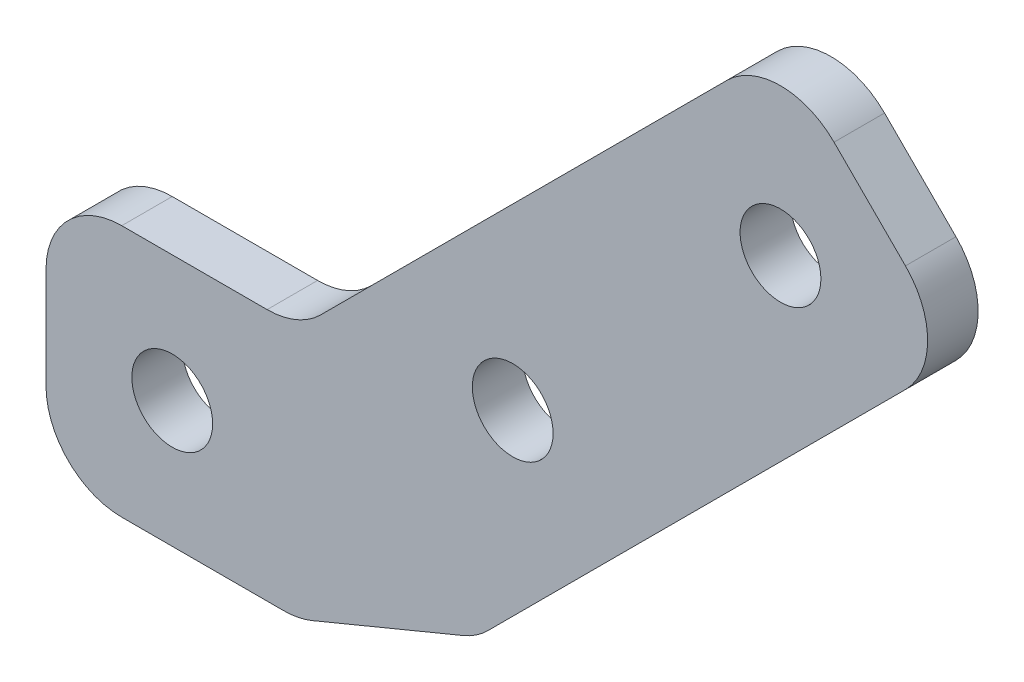
ISO-10303-21;
HEADER;
FILE_DESCRIPTION(('STEP AP214'),'2;1');
FILE_NAME('part.step','',(''),(''),'','','');
FILE_SCHEMA(('AUTOMOTIVE_DESIGN { 1 0 10303 214 1 1 1 1 }'));
ENDSEC;
DATA;
#1=APPLICATION_CONTEXT('core data for automotive mechanical design processes');
#2=APPLICATION_PROTOCOL_DEFINITION('international standard','automotive_design',2000,#1);
#3=PRODUCT_CONTEXT('',#1,'mechanical');
#4=PRODUCT('Part','Part','',(#3));
#5=PRODUCT_RELATED_PRODUCT_CATEGORY('part','',(#4));
#6=PRODUCT_DEFINITION_FORMATION('','',#4);
#7=PRODUCT_DEFINITION_CONTEXT('part definition',#1,'design');
#8=PRODUCT_DEFINITION('design','',#6,#7);
#9=PRODUCT_DEFINITION_SHAPE('','',#8);
#10=(LENGTH_UNIT() NAMED_UNIT(*) SI_UNIT(.MILLI.,.METRE.));
#11=(NAMED_UNIT(*) PLANE_ANGLE_UNIT() SI_UNIT($,.RADIAN.));
#12=(NAMED_UNIT(*) SI_UNIT($,.STERADIAN.) SOLID_ANGLE_UNIT());
#13=UNCERTAINTY_MEASURE_WITH_UNIT(LENGTH_MEASURE(1.E-05),#10,'distance_accuracy_value','');
#14=(GEOMETRIC_REPRESENTATION_CONTEXT(3) GLOBAL_UNCERTAINTY_ASSIGNED_CONTEXT((#13)) GLOBAL_UNIT_ASSIGNED_CONTEXT((#10,
#11,#12)) REPRESENTATION_CONTEXT('',''));
#15=CARTESIAN_POINT('',(0.,0.,0.));
#16=DIRECTION('',(0.,0.,1.));
#17=DIRECTION('',(1.,0.,0.));
#18=AXIS2_PLACEMENT_3D('',#15,#16,#17);
#19=CARTESIAN_POINT('',(0.,0.,2.));
#20=DIRECTION('',(0.,1.,0.));
#21=DIRECTION('',(-1.,0.,0.));
#22=AXIS2_PLACEMENT_3D('',#19,#20,#21);
#23=PLANE('',#22);
#24=DIRECTION('',(1.,0.,0.));
#25=VECTOR('',#24,1.);
#26=CARTESIAN_POINT('',(0.,0.,2.));
#27=LINE('',#26,#25);
#28=CARTESIAN_POINT('',(3.,0.,2.));
#29=VERTEX_POINT('',#28);
#30=CARTESIAN_POINT('',(9.40326289786103,0.,2.));
#31=VERTEX_POINT('',#30);
#32=EDGE_CURVE('E157',#29,#31,#27,.T.);
#33=ORIENTED_EDGE('',*,*,#32,.F.);
#34=DIRECTION('',(0.,0.,-1.));
#35=VECTOR('',#34,1.);
#36=CARTESIAN_POINT('',(3.,0.,0.));
#37=LINE('',#36,#35);
#38=CARTESIAN_POINT('',(3.,0.,0.));
#39=VERTEX_POINT('',#38);
#40=EDGE_CURVE('E142',#29,#39,#37,.T.);
#41=ORIENTED_EDGE('',*,*,#40,.T.);
#42=DIRECTION('',(1.,0.,0.));
#43=VECTOR('',#42,1.);
#44=CARTESIAN_POINT('',(0.,0.,0.));
#45=LINE('',#44,#43);
#46=CARTESIAN_POINT('',(9.40326289786103,0.,0.));
#47=VERTEX_POINT('',#46);
#48=EDGE_CURVE('E154',#39,#47,#45,.T.);
#49=ORIENTED_EDGE('',*,*,#48,.T.);
#50=DIRECTION('',(0.,0.,-1.));
#51=VECTOR('',#50,1.);
#52=CARTESIAN_POINT('',(9.40326289786103,0.,2.));
#53=LINE('',#52,#51);
#54=EDGE_CURVE('E159',#47,#31,#53,.F.);
#55=ORIENTED_EDGE('',*,*,#54,.T.);
#56=EDGE_LOOP('',(#33,#41,#49,#55));
#57=FACE_BOUND('',#56,.T.);
#58=ADVANCED_FACE('F37',(#57),#23,.F.);
#59=CARTESIAN_POINT('',(1.46446609406727,-3.53553390593275,2.));
#60=DIRECTION('',(-0.382683432365091,0.923879532511286,0.));
#61=DIRECTION('',(-0.923879532511286,-0.382683432365091,0.));
#62=AXIS2_PLACEMENT_3D('',#59,#60,#61);
#63=PLANE('',#62);
#64=DIRECTION('',(0.923879532511286,0.382683432365091,0.));
#65=VECTOR('',#64,1.);
#66=CARTESIAN_POINT('',(1.46446609406727,-3.53553390593275,2.));
#67=LINE('',#66,#65);
#68=CARTESIAN_POINT('',(10.5513131949563,0.228361402466139,2.));
#69=VERTEX_POINT('',#68);
#70=CARTESIAN_POINT('',(16.5197546169092,2.70057078566839,2.));
#71=VERTEX_POINT('',#70);
#72=EDGE_CURVE('E332',#69,#71,#67,.T.);
#73=ORIENTED_EDGE('',*,*,#72,.F.);
#74=DIRECTION('',(0.,0.,-1.));
#75=VECTOR('',#74,1.);
#76=CARTESIAN_POINT('',(10.5513131949563,0.228361402466139,2.));
#77=LINE('',#76,#75);
#78=CARTESIAN_POINT('',(10.5513131949563,0.228361402466139,0.));
#79=VERTEX_POINT('',#78);
#80=EDGE_CURVE('E225',#69,#79,#77,.T.);
#81=ORIENTED_EDGE('',*,*,#80,.T.);
#82=DIRECTION('',(0.923879532511286,0.382683432365091,0.));
#83=VECTOR('',#82,1.);
#84=CARTESIAN_POINT('',(1.46446609406727,-3.53553390593275,0.));
#85=LINE('',#84,#83);
#86=CARTESIAN_POINT('',(16.5197546169092,2.70057078566839,0.));
#87=VERTEX_POINT('',#86);
#88=EDGE_CURVE('E165',#79,#87,#85,.T.);
#89=ORIENTED_EDGE('',*,*,#88,.T.);
#90=DIRECTION('',(0.,0.,-1.));
#91=VECTOR('',#90,1.);
#92=CARTESIAN_POINT('',(16.5197546169092,2.70057078566839,2.));
#93=LINE('',#92,#91);
#94=EDGE_CURVE('E223',#87,#71,#93,.F.);
#95=ORIENTED_EDGE('',*,*,#94,.T.);
#96=EDGE_LOOP('',(#73,#81,#89,#95));
#97=FACE_BOUND('',#96,.T.);
#98=ADVANCED_FACE('F284',(#97),#63,.F.);
#99=CARTESIAN_POINT('',(7.07106781186552,-7.07106781186549,2.));
#100=DIRECTION('',(-0.707106781186549,0.707106781186546,0.));
#101=DIRECTION('',(-0.707106781186546,-0.707106781186549,0.));
#102=AXIS2_PLACEMENT_3D('',#99,#100,#101);
#103=PLANE('',#102);
#104=DIRECTION('',(0.707106781186546,0.707106781186549,0.));
#105=VECTOR('',#104,1.);
#106=CARTESIAN_POINT('',(7.07106781186552,-7.07106781186549,2.));
#107=LINE('',#106,#105);
#108=CARTESIAN_POINT('',(17.4930246633736,3.35088903964262,2.));
#109=VERTEX_POINT('',#108);
#110=CARTESIAN_POINT('',(34.0416305603426,19.8994949366117,2.));
#111=VERTEX_POINT('',#110);
#112=EDGE_CURVE('E331',#109,#111,#107,.T.);
#113=ORIENTED_EDGE('',*,*,#112,.F.);
#114=DIRECTION('',(0.,0.,-1.));
#115=VECTOR('',#114,1.);
#116=CARTESIAN_POINT('',(17.4930246633736,3.35088903964262,2.));
#117=LINE('',#116,#115);
#118=CARTESIAN_POINT('',(17.4930246633736,3.35088903964262,0.));
#119=VERTEX_POINT('',#118);
#120=EDGE_CURVE('E230',#109,#119,#117,.T.);
#121=ORIENTED_EDGE('',*,*,#120,.T.);
#122=DIRECTION('',(0.707106781186546,0.707106781186549,0.));
#123=VECTOR('',#122,1.);
#124=CARTESIAN_POINT('',(7.07106781186552,-7.07106781186549,0.));
#125=LINE('',#124,#123);
#126=CARTESIAN_POINT('',(34.0416305603426,19.8994949366117,0.));
#127=VERTEX_POINT('',#126);
#128=EDGE_CURVE('E169',#119,#127,#125,.T.);
#129=ORIENTED_EDGE('',*,*,#128,.T.);
#130=DIRECTION('',(0.,0.,-1.));
#131=VECTOR('',#130,1.);
#132=CARTESIAN_POINT('',(34.0416305603426,19.8994949366117,2.));
#133=LINE('',#132,#131);
#134=EDGE_CURVE('E228',#127,#111,#133,.F.);
#135=ORIENTED_EDGE('',*,*,#134,.T.);
#136=EDGE_LOOP('',(#113,#121,#129,#135));
#137=FACE_BOUND('',#136,.T.);
#138=ADVANCED_FACE('F289',(#137),#103,.F.);
#139=CARTESIAN_POINT('',(29.0918830920367,29.0918830920368,2.));
#140=DIRECTION('',(0.707106781186546,0.707106781186549,0.));
#141=DIRECTION('',(-0.707106781186549,0.707106781186546,0.));
#142=AXIS2_PLACEMENT_3D('',#139,#140,#141);
#143=PLANE('',#142);
#144=DIRECTION('',(0.707106781186549,-0.707106781186546,0.));
#145=VECTOR('',#144,1.);
#146=CARTESIAN_POINT('',(29.0918830920367,29.0918830920368,2.));
#147=LINE('',#146,#145);
#148=CARTESIAN_POINT('',(31.2132034355964,26.9705627484772,2.));
#149=VERTEX_POINT('',#148);
#150=CARTESIAN_POINT('',(34.0416305603426,24.142135623731,2.));
#151=VERTEX_POINT('',#150);
#152=EDGE_CURVE('E259',#149,#151,#147,.T.);
#153=ORIENTED_EDGE('',*,*,#152,.T.);
#154=DIRECTION('',(0.,0.,-1.));
#155=VECTOR('',#154,1.);
#156=CARTESIAN_POINT('',(34.0416305603426,24.142135623731,0.));
#157=LINE('',#156,#155);
#158=CARTESIAN_POINT('',(34.0416305603426,24.142135623731,0.));
#159=VERTEX_POINT('',#158);
#160=EDGE_CURVE('E235',#151,#159,#157,.T.);
#161=ORIENTED_EDGE('',*,*,#160,.T.);
#162=DIRECTION('',(0.707106781186549,-0.707106781186546,0.));
#163=VECTOR('',#162,1.);
#164=CARTESIAN_POINT('',(29.0918830920367,29.0918830920368,0.));
#165=LINE('',#164,#163);
#166=CARTESIAN_POINT('',(31.2132034355964,26.9705627484772,0.));
#167=VERTEX_POINT('',#166);
#168=EDGE_CURVE('E177',#167,#159,#165,.T.);
#169=ORIENTED_EDGE('',*,*,#168,.F.);
#170=DIRECTION('',(0.,0.,-1.));
#171=VECTOR('',#170,1.);
#172=CARTESIAN_POINT('',(31.2132034355964,26.9705627484772,2.));
#173=LINE('',#172,#171);
#174=EDGE_CURVE('E233',#167,#149,#173,.F.);
#175=ORIENTED_EDGE('',*,*,#174,.T.);
#176=EDGE_LOOP('',(#153,#161,#169,#175));
#177=FACE_BOUND('',#176,.T.);
#178=ADVANCED_FACE('F352',(#177),#143,.T.);
#179=CARTESIAN_POINT('',(0.,0.,2.));
#180=DIRECTION('',(-0.707106781186549,0.707106781186546,0.));
#181=DIRECTION('',(-0.707106781186546,-0.707106781186549,0.));
#182=AXIS2_PLACEMENT_3D('',#179,#180,#181);
#183=PLANE('',#182);
#184=DIRECTION('',(0.707106781186546,0.707106781186549,0.));
#185=VECTOR('',#184,1.);
#186=CARTESIAN_POINT('',(0.,0.,2.));
#187=LINE('',#186,#185);
#188=CARTESIAN_POINT('',(10.8786796564403,10.8786796564404,2.));
#189=VERTEX_POINT('',#188);
#190=CARTESIAN_POINT('',(26.9705627484771,26.9705627484772,2.));
#191=VERTEX_POINT('',#190);
#192=EDGE_CURVE('E254',#189,#191,#187,.T.);
#193=ORIENTED_EDGE('',*,*,#192,.T.);
#194=DIRECTION('',(0.,0.,-1.));
#195=VECTOR('',#194,1.);
#196=CARTESIAN_POINT('',(26.9705627484771,26.9705627484772,2.));
#197=LINE('',#196,#195);
#198=CARTESIAN_POINT('',(26.9705627484771,26.9705627484772,0.));
#199=VERTEX_POINT('',#198);
#200=EDGE_CURVE('E240',#191,#199,#197,.T.);
#201=ORIENTED_EDGE('',*,*,#200,.T.);
#202=DIRECTION('',(0.707106781186546,0.707106781186549,0.));
#203=VECTOR('',#202,1.);
#204=CARTESIAN_POINT('',(0.,0.,0.));
#205=LINE('',#204,#203);
#206=CARTESIAN_POINT('',(10.8786796564403,10.8786796564404,0.));
#207=VERTEX_POINT('',#206);
#208=EDGE_CURVE('E180',#207,#199,#205,.T.);
#209=ORIENTED_EDGE('',*,*,#208,.F.);
#210=DIRECTION('',(0.,0.,-1.));
#211=VECTOR('',#210,1.);
#212=CARTESIAN_POINT('',(10.8786796564403,10.8786796564404,2.));
#213=LINE('',#212,#211);
#214=EDGE_CURVE('E238',#207,#189,#213,.F.);
#215=ORIENTED_EDGE('',*,*,#214,.T.);
#216=EDGE_LOOP('',(#193,#201,#209,#215));
#217=FACE_BOUND('',#216,.T.);
#218=ADVANCED_FACE('F248',(#217),#183,.T.);
#219=CARTESIAN_POINT('',(0.,10.,2.));
#220=DIRECTION('',(0.,1.,0.));
#221=DIRECTION('',(-1.,0.,0.));
#222=AXIS2_PLACEMENT_3D('',#219,#220,#221);
#223=PLANE('',#222);
#224=DIRECTION('',(1.,0.,0.));
#225=VECTOR('',#224,1.);
#226=CARTESIAN_POINT('',(0.,10.,0.));
#227=LINE('',#226,#225);
#228=CARTESIAN_POINT('',(3.,10.,0.));
#229=VERTEX_POINT('',#228);
#230=CARTESIAN_POINT('',(8.75735931288067,10.,0.));
#231=VERTEX_POINT('',#230);
#232=EDGE_CURVE('E183',#229,#231,#227,.T.);
#233=ORIENTED_EDGE('',*,*,#232,.F.);
#234=DIRECTION('',(0.,0.,-1.));
#235=VECTOR('',#234,1.);
#236=CARTESIAN_POINT('',(3.,10.,2.));
#237=LINE('',#236,#235);
#238=CARTESIAN_POINT('',(3.,10.,2.));
#239=VERTEX_POINT('',#238);
#240=EDGE_CURVE('E57',#229,#239,#237,.F.);
#241=ORIENTED_EDGE('',*,*,#240,.T.);
#242=DIRECTION('',(1.,0.,0.));
#243=VECTOR('',#242,1.);
#244=CARTESIAN_POINT('',(0.,10.,2.));
#245=LINE('',#244,#243);
#246=CARTESIAN_POINT('',(8.75735931288067,10.,2.));
#247=VERTEX_POINT('',#246);
#248=EDGE_CURVE('E251',#239,#247,#245,.T.);
#249=ORIENTED_EDGE('',*,*,#248,.T.);
#250=DIRECTION('',(0.,0.,-1.));
#251=VECTOR('',#250,1.);
#252=CARTESIAN_POINT('',(8.75735931288067,10.,0.));
#253=LINE('',#252,#251);
#254=EDGE_CURVE('E219',#247,#231,#253,.T.);
#255=ORIENTED_EDGE('',*,*,#254,.T.);
#256=EDGE_LOOP('',(#233,#241,#249,#255));
#257=FACE_BOUND('',#256,.T.);
#258=ADVANCED_FACE('F250',(#257),#223,.T.);
#259=CARTESIAN_POINT('',(18.4852813742386,11.4142135623731,2.));
#260=DIRECTION('',(0.,0.,-1.));
#261=DIRECTION('',(-1.,0.,0.));
#262=AXIS2_PLACEMENT_3D('',#259,#260,#261);
#263=CYLINDRICAL_SURFACE('',#262,1.6);
#264=CARTESIAN_POINT('',(18.4852813742386,11.4142135623731,2.));
#265=DIRECTION('',(0.,0.,1.));
#266=DIRECTION('',(1.,0.,0.));
#267=AXIS2_PLACEMENT_3D('',#264,#265,#266);
#268=CIRCLE('',#267,1.6);
#269=CARTESIAN_POINT('',(20.0852813742386,11.4142135623731,2.));
#270=VERTEX_POINT('',#269);
#271=EDGE_CURVE('E257',#270,#270,#268,.T.);
#272=ORIENTED_EDGE('',*,*,#271,.T.);
#273=EDGE_LOOP('',(#272));
#274=FACE_BOUND('',#273,.T.);
#275=CARTESIAN_POINT('',(18.4852813742386,11.4142135623731,0.));
#276=DIRECTION('',(0.,0.,1.));
#277=DIRECTION('',(1.,0.,0.));
#278=AXIS2_PLACEMENT_3D('',#275,#276,#277);
#279=CIRCLE('',#278,1.6);
#280=CARTESIAN_POINT('',(20.0852813742386,11.4142135623731,0.));
#281=VERTEX_POINT('',#280);
#282=EDGE_CURVE('E188',#281,#281,#279,.T.);
#283=ORIENTED_EDGE('',*,*,#282,.F.);
#284=EDGE_LOOP('',(#283));
#285=FACE_BOUND('',#284,.T.);
#286=ADVANCED_FACE('F363',(#274,#285),#263,.F.);
#287=CARTESIAN_POINT('',(0.,0.,2.));
#288=DIRECTION('',(-1.,0.,0.));
#289=DIRECTION('',(0.,0.,1.));
#290=AXIS2_PLACEMENT_3D('',#287,#288,#289);
#291=PLANE('',#290);
#292=DIRECTION('',(0.,1.,0.));
#293=VECTOR('',#292,1.);
#294=CARTESIAN_POINT('',(0.,0.,0.));
#295=LINE('',#294,#293);
#296=CARTESIAN_POINT('',(0.,3.,0.));
#297=VERTEX_POINT('',#296);
#298=CARTESIAN_POINT('',(0.,7.,0.));
#299=VERTEX_POINT('',#298);
#300=EDGE_CURVE('E186',#297,#299,#295,.T.);
#301=ORIENTED_EDGE('',*,*,#300,.F.);
#302=DIRECTION('',(0.,0.,-1.));
#303=VECTOR('',#302,1.);
#304=CARTESIAN_POINT('',(0.,3.,2.));
#305=LINE('',#304,#303);
#306=CARTESIAN_POINT('',(0.,3.,2.));
#307=VERTEX_POINT('',#306);
#308=EDGE_CURVE('E143',#297,#307,#305,.F.);
#309=ORIENTED_EDGE('',*,*,#308,.T.);
#310=DIRECTION('',(0.,1.,0.));
#311=VECTOR('',#310,1.);
#312=CARTESIAN_POINT('',(0.,0.,2.));
#313=LINE('',#312,#311);
#314=CARTESIAN_POINT('',(0.,7.,2.));
#315=VERTEX_POINT('',#314);
#316=EDGE_CURVE('E253',#307,#315,#313,.T.);
#317=ORIENTED_EDGE('',*,*,#316,.T.);
#318=DIRECTION('',(0.,0.,-1.));
#319=VECTOR('',#318,1.);
#320=CARTESIAN_POINT('',(0.,7.,2.));
#321=LINE('',#320,#319);
#322=EDGE_CURVE('E148',#315,#299,#321,.T.);
#323=ORIENTED_EDGE('',*,*,#322,.T.);
#324=EDGE_LOOP('',(#301,#309,#317,#323));
#325=FACE_BOUND('',#324,.T.);
#326=ADVANCED_FACE('F296',(#325),#291,.T.);
#327=CARTESIAN_POINT('',(5.,5.,2.));
#328=DIRECTION('',(0.,0.,-1.));
#329=DIRECTION('',(-1.,0.,0.));
#330=AXIS2_PLACEMENT_3D('',#327,#328,#329);
#331=CYLINDRICAL_SURFACE('',#330,1.6);
#332=CARTESIAN_POINT('',(5.,5.,2.));
#333=DIRECTION('',(0.,0.,1.));
#334=DIRECTION('',(1.,0.,0.));
#335=AXIS2_PLACEMENT_3D('',#332,#333,#334);
#336=CIRCLE('',#335,1.6);
#337=CARTESIAN_POINT('',(6.6,5.,2.));
#338=VERTEX_POINT('',#337);
#339=EDGE_CURVE('E194',#338,#338,#336,.T.);
#340=ORIENTED_EDGE('',*,*,#339,.T.);
#341=EDGE_LOOP('',(#340));
#342=FACE_BOUND('',#341,.T.);
#343=CARTESIAN_POINT('',(5.,5.,0.));
#344=DIRECTION('',(0.,0.,1.));
#345=DIRECTION('',(1.,0.,0.));
#346=AXIS2_PLACEMENT_3D('',#343,#344,#345);
#347=CIRCLE('',#346,1.6);
#348=CARTESIAN_POINT('',(6.6,5.,0.));
#349=VERTEX_POINT('',#348);
#350=EDGE_CURVE('E166',#349,#349,#347,.T.);
#351=ORIENTED_EDGE('',*,*,#350,.F.);
#352=EDGE_LOOP('',(#351));
#353=FACE_BOUND('',#352,.T.);
#354=ADVANCED_FACE('F280',(#342,#353),#331,.F.);
#355=CARTESIAN_POINT('',(29.0918830920367,22.0208152801713,2.));
#356=DIRECTION('',(0.,0.,-1.));
#357=DIRECTION('',(-1.,0.,0.));
#358=AXIS2_PLACEMENT_3D('',#355,#356,#357);
#359=CYLINDRICAL_SURFACE('',#358,1.6);
#360=CARTESIAN_POINT('',(29.0918830920367,22.0208152801713,2.));
#361=DIRECTION('',(0.,0.,1.));
#362=DIRECTION('',(1.,0.,0.));
#363=AXIS2_PLACEMENT_3D('',#360,#361,#362);
#364=CIRCLE('',#363,1.6);
#365=CARTESIAN_POINT('',(30.6918830920367,22.0208152801713,2.));
#366=VERTEX_POINT('',#365);
#367=EDGE_CURVE('E195',#366,#366,#364,.T.);
#368=ORIENTED_EDGE('',*,*,#367,.T.);
#369=EDGE_LOOP('',(#368));
#370=FACE_BOUND('',#369,.T.);
#371=CARTESIAN_POINT('',(29.0918830920367,22.0208152801713,0.));
#372=DIRECTION('',(0.,0.,1.));
#373=DIRECTION('',(1.,0.,0.));
#374=AXIS2_PLACEMENT_3D('',#371,#372,#373);
#375=CIRCLE('',#374,1.6);
#376=CARTESIAN_POINT('',(30.6918830920367,22.0208152801713,0.));
#377=VERTEX_POINT('',#376);
#378=EDGE_CURVE('E191',#377,#377,#375,.T.);
#379=ORIENTED_EDGE('',*,*,#378,.F.);
#380=EDGE_LOOP('',(#379));
#381=FACE_BOUND('',#380,.T.);
#382=ADVANCED_FACE('F267',(#370,#381),#359,.F.);
#383=CARTESIAN_POINT('',(0.,0.,2.));
#384=DIRECTION('',(0.,0.,1.));
#385=DIRECTION('',(1.,0.,0.));
#386=AXIS2_PLACEMENT_3D('',#383,#384,#385);
#387=PLANE('',#386);
#388=ORIENTED_EDGE('',*,*,#339,.F.);
#389=EDGE_LOOP('',(#388));
#390=FACE_BOUND('',#389,.T.);
#391=ORIENTED_EDGE('',*,*,#316,.F.);
#392=CARTESIAN_POINT('',(3.,3.,2.));
#393=DIRECTION('',(0.,0.,1.));
#394=DIRECTION('',(1.,0.,0.));
#395=AXIS2_PLACEMENT_3D('',#392,#393,#394);
#396=CIRCLE('',#395,3.);
#397=EDGE_CURVE('E217',#307,#29,#396,.T.);
#398=ORIENTED_EDGE('',*,*,#397,.T.);
#399=ORIENTED_EDGE('',*,*,#32,.T.);
#400=CARTESIAN_POINT('',(9.40326289786103,3.,2.));
#401=DIRECTION('',(0.,0.,1.));
#402=DIRECTION('',(1.,0.,0.));
#403=AXIS2_PLACEMENT_3D('',#400,#401,#402);
#404=CIRCLE('',#403,3.);
#405=EDGE_CURVE('E213',#31,#69,#404,.T.);
#406=ORIENTED_EDGE('',*,*,#405,.T.);
#407=ORIENTED_EDGE('',*,*,#72,.T.);
#408=CARTESIAN_POINT('',(15.3717043198139,5.47220938320225,2.));
#409=DIRECTION('',(0.,0.,1.));
#410=DIRECTION('',(1.,0.,0.));
#411=AXIS2_PLACEMENT_3D('',#408,#409,#410);
#412=CIRCLE('',#411,3.);
#413=EDGE_CURVE('E211',#71,#109,#412,.T.);
#414=ORIENTED_EDGE('',*,*,#413,.T.);
#415=ORIENTED_EDGE('',*,*,#112,.T.);
#416=CARTESIAN_POINT('',(31.9203102167829,22.0208152801714,2.));
#417=DIRECTION('',(0.,0.,1.));
#418=DIRECTION('',(1.,0.,0.));
#419=AXIS2_PLACEMENT_3D('',#416,#417,#418);
#420=CIRCLE('',#419,3.);
#421=EDGE_CURVE('E209',#111,#151,#420,.T.);
#422=ORIENTED_EDGE('',*,*,#421,.T.);
#423=ORIENTED_EDGE('',*,*,#152,.F.);
#424=CARTESIAN_POINT('',(29.0918830920367,24.8492424049176,2.));
#425=DIRECTION('',(0.,0.,1.));
#426=DIRECTION('',(1.,0.,0.));
#427=AXIS2_PLACEMENT_3D('',#424,#425,#426);
#428=CIRCLE('',#427,3.);
#429=EDGE_CURVE('E207',#149,#191,#428,.T.);
#430=ORIENTED_EDGE('',*,*,#429,.T.);
#431=ORIENTED_EDGE('',*,*,#192,.F.);
#432=CARTESIAN_POINT('',(8.75735931288067,13.,2.));
#433=DIRECTION('',(0.,0.,1.));
#434=DIRECTION('',(1.,0.,0.));
#435=AXIS2_PLACEMENT_3D('',#432,#433,#434);
#436=CIRCLE('',#435,3.);
#437=EDGE_CURVE('E11',#189,#247,#436,.F.);
#438=ORIENTED_EDGE('',*,*,#437,.T.);
#439=ORIENTED_EDGE('',*,*,#248,.F.);
#440=CARTESIAN_POINT('',(3.,7.,2.));
#441=DIRECTION('',(0.,0.,1.));
#442=DIRECTION('',(1.,0.,0.));
#443=AXIS2_PLACEMENT_3D('',#440,#441,#442);
#444=CIRCLE('',#443,3.);
#445=EDGE_CURVE('E215',#239,#315,#444,.T.);
#446=ORIENTED_EDGE('',*,*,#445,.T.);
#447=EDGE_LOOP('',(#391,#398,#399,#406,#407,#414,#415,#422,#423,#430,#431,#438,#439,#446));
#448=FACE_BOUND('',#447,.T.);
#449=ORIENTED_EDGE('',*,*,#271,.F.);
#450=EDGE_LOOP('',(#449));
#451=FACE_BOUND('',#450,.T.);
#452=ORIENTED_EDGE('',*,*,#367,.F.);
#453=EDGE_LOOP('',(#452));
#454=FACE_BOUND('',#453,.T.);
#455=ADVANCED_FACE('F270',(#390,#448,#451,#454),#387,.T.);
#456=CARTESIAN_POINT('',(0.,0.,0.));
#457=DIRECTION('',(0.,0.,1.));
#458=DIRECTION('',(1.,0.,0.));
#459=AXIS2_PLACEMENT_3D('',#456,#457,#458);
#460=PLANE('',#459);
#461=ORIENTED_EDGE('',*,*,#350,.T.);
#462=EDGE_LOOP('',(#461));
#463=FACE_BOUND('',#462,.T.);
#464=ORIENTED_EDGE('',*,*,#48,.F.);
#465=CARTESIAN_POINT('',(3.,3.,0.));
#466=DIRECTION('',(0.,0.,1.));
#467=DIRECTION('',(1.,0.,0.));
#468=AXIS2_PLACEMENT_3D('',#465,#466,#467);
#469=CIRCLE('',#468,3.);
#470=EDGE_CURVE('E138',#39,#297,#469,.F.);
#471=ORIENTED_EDGE('',*,*,#470,.T.);
#472=ORIENTED_EDGE('',*,*,#300,.T.);
#473=CARTESIAN_POINT('',(3.,7.,0.));
#474=DIRECTION('',(0.,0.,1.));
#475=DIRECTION('',(1.,0.,0.));
#476=AXIS2_PLACEMENT_3D('',#473,#474,#475);
#477=CIRCLE('',#476,3.);
#478=EDGE_CURVE('E149',#299,#229,#477,.F.);
#479=ORIENTED_EDGE('',*,*,#478,.T.);
#480=ORIENTED_EDGE('',*,*,#232,.T.);
#481=CARTESIAN_POINT('',(8.75735931288067,13.,0.));
#482=DIRECTION('',(0.,0.,1.));
#483=DIRECTION('',(1.,0.,0.));
#484=AXIS2_PLACEMENT_3D('',#481,#482,#483);
#485=CIRCLE('',#484,3.);
#486=EDGE_CURVE('E45',#231,#207,#485,.T.);
#487=ORIENTED_EDGE('',*,*,#486,.T.);
#488=ORIENTED_EDGE('',*,*,#208,.T.);
#489=CARTESIAN_POINT('',(29.0918830920367,24.8492424049176,0.));
#490=DIRECTION('',(0.,0.,1.));
#491=DIRECTION('',(1.,0.,0.));
#492=AXIS2_PLACEMENT_3D('',#489,#490,#491);
#493=CIRCLE('',#492,3.);
#494=EDGE_CURVE('E158',#199,#167,#493,.F.);
#495=ORIENTED_EDGE('',*,*,#494,.T.);
#496=ORIENTED_EDGE('',*,*,#168,.T.);
#497=CARTESIAN_POINT('',(31.9203102167829,22.0208152801714,0.));
#498=DIRECTION('',(0.,0.,1.));
#499=DIRECTION('',(1.,0.,0.));
#500=AXIS2_PLACEMENT_3D('',#497,#498,#499);
#501=CIRCLE('',#500,3.);
#502=EDGE_CURVE('E198',#159,#127,#501,.F.);
#503=ORIENTED_EDGE('',*,*,#502,.T.);
#504=ORIENTED_EDGE('',*,*,#128,.F.);
#505=CARTESIAN_POINT('',(15.3717043198139,5.47220938320225,0.));
#506=DIRECTION('',(0.,0.,1.));
#507=DIRECTION('',(1.,0.,0.));
#508=AXIS2_PLACEMENT_3D('',#505,#506,#507);
#509=CIRCLE('',#508,3.);
#510=EDGE_CURVE('E200',#119,#87,#509,.F.);
#511=ORIENTED_EDGE('',*,*,#510,.T.);
#512=ORIENTED_EDGE('',*,*,#88,.F.);
#513=CARTESIAN_POINT('',(9.40326289786103,3.,0.));
#514=DIRECTION('',(0.,0.,1.));
#515=DIRECTION('',(1.,0.,0.));
#516=AXIS2_PLACEMENT_3D('',#513,#514,#515);
#517=CIRCLE('',#516,3.);
#518=EDGE_CURVE('E164',#79,#47,#517,.F.);
#519=ORIENTED_EDGE('',*,*,#518,.T.);
#520=EDGE_LOOP('',(#464,#471,#472,#479,#480,#487,#488,#495,#496,#503,#504,#511,#512,#519));
#521=FACE_BOUND('',#520,.T.);
#522=ORIENTED_EDGE('',*,*,#282,.T.);
#523=EDGE_LOOP('',(#522));
#524=FACE_BOUND('',#523,.T.);
#525=ORIENTED_EDGE('',*,*,#378,.T.);
#526=EDGE_LOOP('',(#525));
#527=FACE_BOUND('',#526,.T.);
#528=ADVANCED_FACE('F161',(#463,#521,#524,#527),#460,.F.);
#529=CARTESIAN_POINT('',(3.,3.,2.));
#530=DIRECTION('',(0.,0.,1.));
#531=DIRECTION('',(1.,0.,0.));
#532=AXIS2_PLACEMENT_3D('',#529,#530,#531);
#533=CYLINDRICAL_SURFACE('',#532,3.);
#534=ORIENTED_EDGE('',*,*,#397,.F.);
#535=ORIENTED_EDGE('',*,*,#308,.F.);
#536=ORIENTED_EDGE('',*,*,#470,.F.);
#537=ORIENTED_EDGE('',*,*,#40,.F.);
#538=EDGE_LOOP('',(#534,#535,#536,#537));
#539=FACE_BOUND('',#538,.T.);
#540=ADVANCED_FACE('F141',(#539),#533,.T.);
#541=CARTESIAN_POINT('',(3.,7.,2.));
#542=DIRECTION('',(0.,0.,-1.));
#543=DIRECTION('',(-1.,0.,0.));
#544=AXIS2_PLACEMENT_3D('',#541,#542,#543);
#545=CYLINDRICAL_SURFACE('',#544,3.);
#546=ORIENTED_EDGE('',*,*,#445,.F.);
#547=ORIENTED_EDGE('',*,*,#240,.F.);
#548=ORIENTED_EDGE('',*,*,#478,.F.);
#549=ORIENTED_EDGE('',*,*,#322,.F.);
#550=EDGE_LOOP('',(#546,#547,#548,#549));
#551=FACE_BOUND('',#550,.T.);
#552=ADVANCED_FACE('F300',(#551),#545,.T.);
#553=CARTESIAN_POINT('',(9.40326289786103,3.,2.));
#554=DIRECTION('',(0.,0.,-1.));
#555=DIRECTION('',(-1.,0.,0.));
#556=AXIS2_PLACEMENT_3D('',#553,#554,#555);
#557=CYLINDRICAL_SURFACE('',#556,3.);
#558=ORIENTED_EDGE('',*,*,#405,.F.);
#559=ORIENTED_EDGE('',*,*,#54,.F.);
#560=ORIENTED_EDGE('',*,*,#518,.F.);
#561=ORIENTED_EDGE('',*,*,#80,.F.);
#562=EDGE_LOOP('',(#558,#559,#560,#561));
#563=FACE_BOUND('',#562,.T.);
#564=ADVANCED_FACE('F303',(#563),#557,.T.);
#565=CARTESIAN_POINT('',(15.3717043198139,5.47220938320225,2.));
#566=DIRECTION('',(0.,0.,-1.));
#567=DIRECTION('',(-1.,0.,0.));
#568=AXIS2_PLACEMENT_3D('',#565,#566,#567);
#569=CYLINDRICAL_SURFACE('',#568,3.);
#570=ORIENTED_EDGE('',*,*,#413,.F.);
#571=ORIENTED_EDGE('',*,*,#94,.F.);
#572=ORIENTED_EDGE('',*,*,#510,.F.);
#573=ORIENTED_EDGE('',*,*,#120,.F.);
#574=EDGE_LOOP('',(#570,#571,#572,#573));
#575=FACE_BOUND('',#574,.T.);
#576=ADVANCED_FACE('F307',(#575),#569,.T.);
#577=CARTESIAN_POINT('',(31.9203102167829,22.0208152801714,2.));
#578=DIRECTION('',(0.,0.,1.));
#579=DIRECTION('',(1.,0.,0.));
#580=AXIS2_PLACEMENT_3D('',#577,#578,#579);
#581=CYLINDRICAL_SURFACE('',#580,3.);
#582=ORIENTED_EDGE('',*,*,#421,.F.);
#583=ORIENTED_EDGE('',*,*,#134,.F.);
#584=ORIENTED_EDGE('',*,*,#502,.F.);
#585=ORIENTED_EDGE('',*,*,#160,.F.);
#586=EDGE_LOOP('',(#582,#583,#584,#585));
#587=FACE_BOUND('',#586,.T.);
#588=ADVANCED_FACE('F311',(#587),#581,.T.);
#589=CARTESIAN_POINT('',(29.0918830920367,24.8492424049176,2.));
#590=DIRECTION('',(0.,0.,-1.));
#591=DIRECTION('',(-1.,0.,0.));
#592=AXIS2_PLACEMENT_3D('',#589,#590,#591);
#593=CYLINDRICAL_SURFACE('',#592,3.);
#594=ORIENTED_EDGE('',*,*,#429,.F.);
#595=ORIENTED_EDGE('',*,*,#174,.F.);
#596=ORIENTED_EDGE('',*,*,#494,.F.);
#597=ORIENTED_EDGE('',*,*,#200,.F.);
#598=EDGE_LOOP('',(#594,#595,#596,#597));
#599=FACE_BOUND('',#598,.T.);
#600=ADVANCED_FACE('F314',(#599),#593,.T.);
#601=CARTESIAN_POINT('',(8.75735931288067,13.,2.));
#602=DIRECTION('',(0.,0.,1.));
#603=DIRECTION('',(1.,0.,0.));
#604=AXIS2_PLACEMENT_3D('',#601,#602,#603);
#605=CYLINDRICAL_SURFACE('',#604,3.);
#606=ORIENTED_EDGE('',*,*,#437,.F.);
#607=ORIENTED_EDGE('',*,*,#214,.F.);
#608=ORIENTED_EDGE('',*,*,#486,.F.);
#609=ORIENTED_EDGE('',*,*,#254,.F.);
#610=EDGE_LOOP('',(#606,#607,#608,#609));
#611=FACE_BOUND('',#610,.T.);
#612=ADVANCED_FACE('F39',(#611),#605,.F.);
#613=CLOSED_SHELL('',(#58,#98,#138,#178,#218,#258,#286,#326,#354,#382,#455,#528,#540,#552,#564,
#576,#588,#600,#612));
#614=MANIFOLD_SOLID_BREP('B2',#613);
#615=ADVANCED_BREP_SHAPE_REPRESENTATION('',(#18,#614),#14);
#616=SHAPE_DEFINITION_REPRESENTATION(#9,#615);
ENDSEC;
END-ISO-10303-21;
